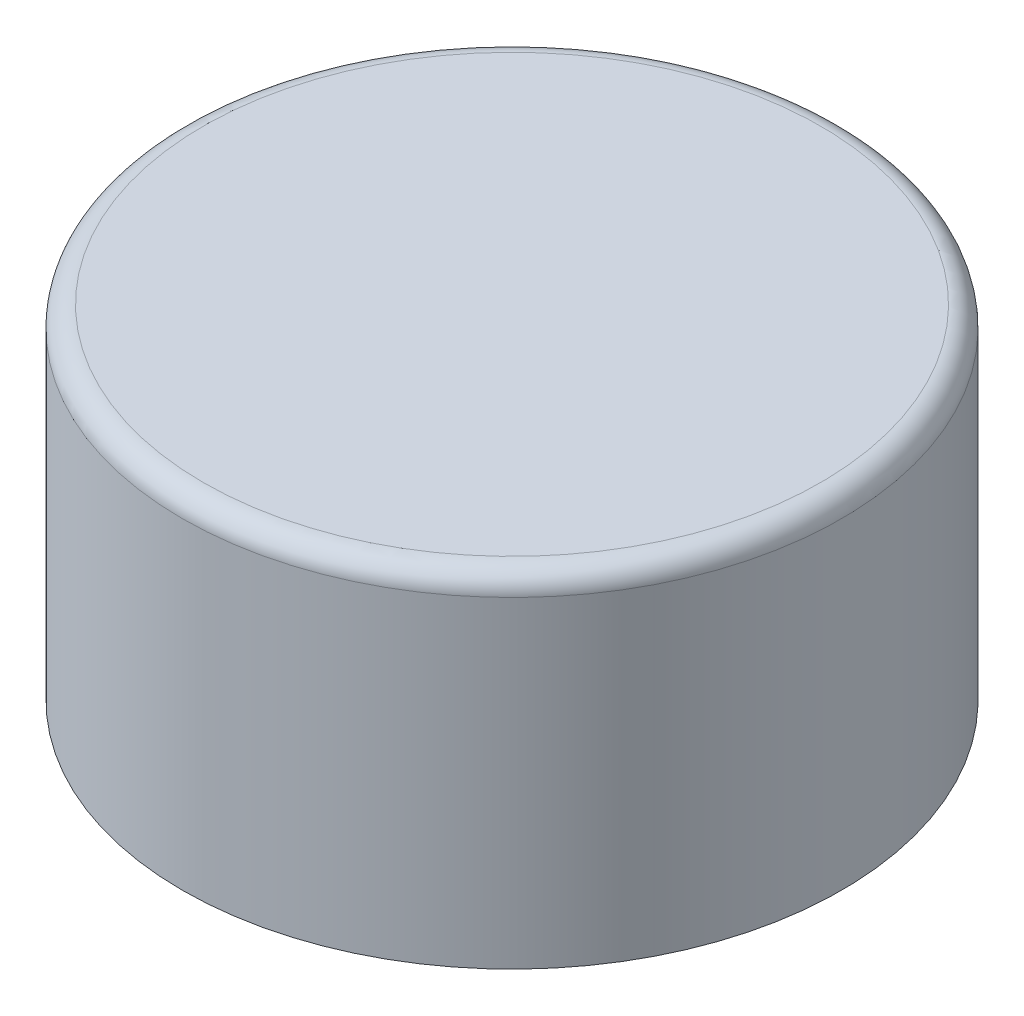
ISO-10303-21;
HEADER;
FILE_DESCRIPTION(('STEP AP214'),'2;1');
FILE_NAME('part.step','',(''),(''),'','','');
FILE_SCHEMA(('AUTOMOTIVE_DESIGN { 1 0 10303 214 1 1 1 1 }'));
ENDSEC;
DATA;
#1=APPLICATION_CONTEXT('core data for automotive mechanical design processes');
#2=APPLICATION_PROTOCOL_DEFINITION('international standard','automotive_design',2000,#1);
#3=PRODUCT_CONTEXT('',#1,'mechanical');
#4=PRODUCT('Part','Part','',(#3));
#5=PRODUCT_RELATED_PRODUCT_CATEGORY('part','',(#4));
#6=PRODUCT_DEFINITION_FORMATION('','',#4);
#7=PRODUCT_DEFINITION_CONTEXT('part definition',#1,'design');
#8=PRODUCT_DEFINITION('design','',#6,#7);
#9=PRODUCT_DEFINITION_SHAPE('','',#8);
#10=(LENGTH_UNIT() NAMED_UNIT(*) SI_UNIT(.MILLI.,.METRE.));
#11=(NAMED_UNIT(*) PLANE_ANGLE_UNIT() SI_UNIT($,.RADIAN.));
#12=(NAMED_UNIT(*) SI_UNIT($,.STERADIAN.) SOLID_ANGLE_UNIT());
#13=UNCERTAINTY_MEASURE_WITH_UNIT(LENGTH_MEASURE(1.E-05),#10,'distance_accuracy_value','');
#14=(GEOMETRIC_REPRESENTATION_CONTEXT(3) GLOBAL_UNCERTAINTY_ASSIGNED_CONTEXT((#13)) GLOBAL_UNIT_ASSIGNED_CONTEXT((#10,
#11,#12)) REPRESENTATION_CONTEXT('',''));
#15=CARTESIAN_POINT('',(0.,0.,0.));
#16=DIRECTION('',(0.,0.,1.));
#17=DIRECTION('',(1.,0.,0.));
#18=AXIS2_PLACEMENT_3D('',#15,#16,#17);
#19=CARTESIAN_POINT('',(0.,7.2644,0.));
#20=DIRECTION('',(0.,-1.,0.));
#21=DIRECTION('',(0.,0.,-1.));
#22=AXIS2_PLACEMENT_3D('',#19,#20,#21);
#23=CYLINDRICAL_SURFACE('',#22,7.493);
#24=CARTESIAN_POINT('',(0.,7.2644,0.));
#25=DIRECTION('',(0.,1.,0.));
#26=DIRECTION('',(0.,0.,1.));
#27=AXIS2_PLACEMENT_3D('',#24,#25,#26);
#28=CIRCLE('',#27,7.493);
#29=CARTESIAN_POINT('',(0.,7.2644,7.493));
#30=VERTEX_POINT('',#29);
#31=EDGE_CURVE('E41',#30,#30,#28,.T.);
#32=ORIENTED_EDGE('',*,*,#31,.F.);
#33=EDGE_LOOP('',(#32));
#34=FACE_BOUND('',#33,.T.);
#35=CARTESIAN_POINT('',(0.,0.,0.));
#36=DIRECTION('',(0.,1.,0.));
#37=DIRECTION('',(0.,0.,1.));
#38=AXIS2_PLACEMENT_3D('',#35,#36,#37);
#39=CIRCLE('',#38,7.493);
#40=CARTESIAN_POINT('',(0.,0.,7.493));
#41=VERTEX_POINT('',#40);
#42=EDGE_CURVE('E45',#41,#41,#39,.T.);
#43=ORIENTED_EDGE('',*,*,#42,.T.);
#44=EDGE_LOOP('',(#43));
#45=FACE_BOUND('',#44,.T.);
#46=ADVANCED_FACE('F30',(#34,#45),#23,.T.);
#47=CARTESIAN_POINT('',(0.,0.,0.));
#48=DIRECTION('',(0.,1.,0.));
#49=DIRECTION('',(0.,0.,1.));
#50=AXIS2_PLACEMENT_3D('',#47,#48,#49);
#51=PLANE('',#50);
#52=ORIENTED_EDGE('',*,*,#42,.F.);
#53=EDGE_LOOP('',(#52));
#54=FACE_BOUND('',#53,.T.);
#55=ADVANCED_FACE('F59',(#54),#51,.F.);
#56=CARTESIAN_POINT('',(0.,7.2644,0.));
#57=DIRECTION('',(0.,1.,0.));
#58=DIRECTION('',(0.,0.,1.));
#59=AXIS2_PLACEMENT_3D('',#56,#57,#58);
#60=PLANE('',#59);
#61=CARTESIAN_POINT('',(0.,7.2644,0.));
#62=DIRECTION('',(0.,1.,0.));
#63=DIRECTION('',(0.,0.,1.));
#64=AXIS2_PLACEMENT_3D('',#61,#62,#63);
#65=CIRCLE('',#64,20.0533);
#66=CARTESIAN_POINT('',(0.,7.2644,20.0533));
#67=VERTEX_POINT('',#66);
#68=EDGE_CURVE('E49',#67,#67,#65,.T.);
#69=ORIENTED_EDGE('',*,*,#68,.F.);
#70=EDGE_LOOP('',(#69));
#71=FACE_BOUND('',#70,.T.);
#72=ORIENTED_EDGE('',*,*,#31,.T.);
#73=EDGE_LOOP('',(#72));
#74=FACE_BOUND('',#73,.T.);
#75=ADVANCED_FACE('F56',(#71,#74),#60,.F.);
#76=CARTESIAN_POINT('',(0.,28.1178,0.));
#77=DIRECTION('',(0.,-1.,0.));
#78=DIRECTION('',(0.,0.,-1.));
#79=AXIS2_PLACEMENT_3D('',#76,#77,#78);
#80=CYLINDRICAL_SURFACE('',#79,20.0533);
#81=CARTESIAN_POINT('',(0.,26.8478,0.));
#82=DIRECTION('',(0.,1.,0.));
#83=DIRECTION('',(0.,0.,1.));
#84=AXIS2_PLACEMENT_3D('',#81,#82,#83);
#85=CIRCLE('',#84,20.0533);
#86=CARTESIAN_POINT('',(0.,26.8478,20.0533));
#87=VERTEX_POINT('',#86);
#88=EDGE_CURVE('E10',#87,#87,#85,.F.);
#89=ORIENTED_EDGE('',*,*,#88,.T.);
#90=EDGE_LOOP('',(#89));
#91=FACE_BOUND('',#90,.T.);
#92=ORIENTED_EDGE('',*,*,#68,.T.);
#93=EDGE_LOOP('',(#92));
#94=FACE_BOUND('',#93,.T.);
#95=ADVANCED_FACE('F54',(#91,#94),#80,.T.);
#96=CARTESIAN_POINT('',(0.,28.1178,0.));
#97=DIRECTION('',(0.,1.,0.));
#98=DIRECTION('',(0.,0.,1.));
#99=AXIS2_PLACEMENT_3D('',#96,#97,#98);
#100=PLANE('',#99);
#101=CARTESIAN_POINT('',(0.,28.1178,0.));
#102=DIRECTION('',(0.,1.,0.));
#103=DIRECTION('',(0.,0.,1.));
#104=AXIS2_PLACEMENT_3D('',#101,#102,#103);
#105=CIRCLE('',#104,18.7833);
#106=CARTESIAN_POINT('',(0.,28.1178,18.7833));
#107=VERTEX_POINT('',#106);
#108=EDGE_CURVE('E37',#107,#107,#105,.T.);
#109=ORIENTED_EDGE('',*,*,#108,.T.);
#110=EDGE_LOOP('',(#109));
#111=FACE_BOUND('',#110,.T.);
#112=ADVANCED_FACE('F73',(#111),#100,.T.);
#113=CARTESIAN_POINT('',(0.,26.8478,0.));
#114=DIRECTION('',(0.,1.,0.));
#115=DIRECTION('',(0.,0.,1.));
#116=AXIS2_PLACEMENT_3D('',#113,#114,#115);
#117=TOROIDAL_SURFACE('',#116,18.7833,1.27);
#118=ORIENTED_EDGE('',*,*,#88,.F.);
#119=EDGE_LOOP('',(#118));
#120=FACE_BOUND('',#119,.T.);
#121=ORIENTED_EDGE('',*,*,#108,.F.);
#122=EDGE_LOOP('',(#121));
#123=FACE_BOUND('',#122,.T.);
#124=ADVANCED_FACE('F32',(#120,#123),#117,.T.);
#125=CLOSED_SHELL('',(#46,#55,#75,#95,#112,#124));
#126=MANIFOLD_SOLID_BREP('B2',#125);
#127=ADVANCED_BREP_SHAPE_REPRESENTATION('',(#18,#126),#14);
#128=SHAPE_DEFINITION_REPRESENTATION(#9,#127);
ENDSEC;
END-ISO-10303-21;
